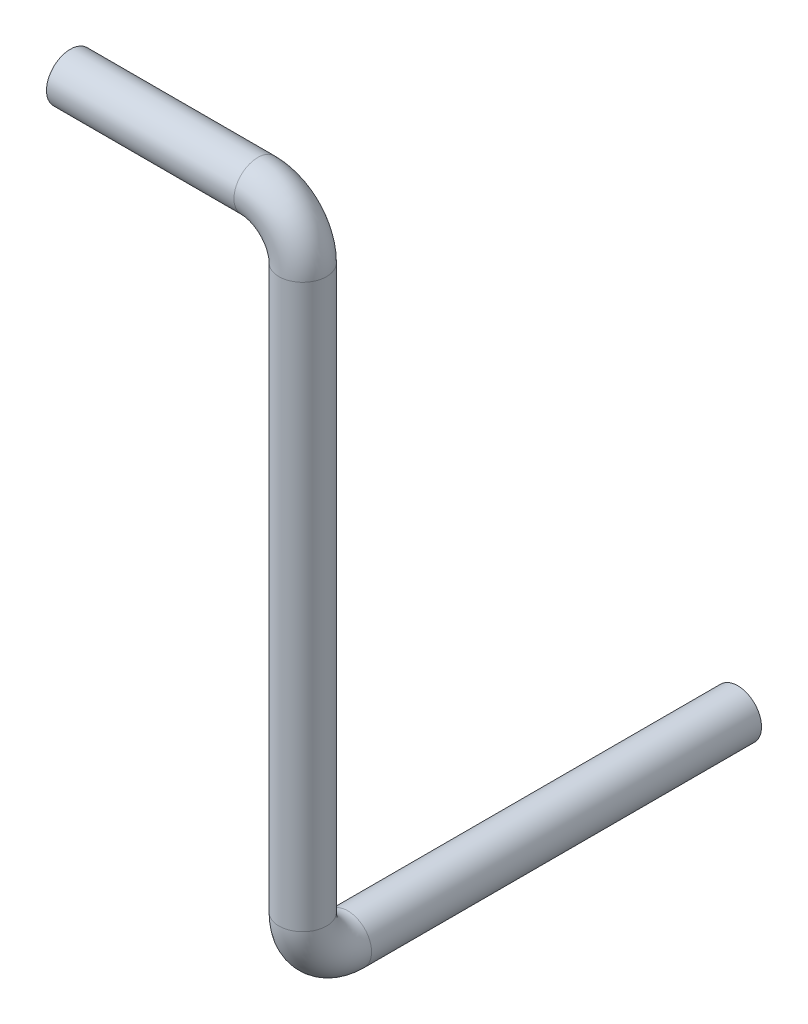
ISO-10303-21;
HEADER;
FILE_DESCRIPTION(('STEP AP214'),'2;1');
FILE_NAME('part.step','',(''),(''),'','','');
FILE_SCHEMA(('AUTOMOTIVE_DESIGN { 1 0 10303 214 1 1 1 1 }'));
ENDSEC;
DATA;
#1=APPLICATION_CONTEXT('core data for automotive mechanical design processes');
#2=APPLICATION_PROTOCOL_DEFINITION('international standard','automotive_design',2000,#1);
#3=PRODUCT_CONTEXT('',#1,'mechanical');
#4=PRODUCT('Part','Part','',(#3));
#5=PRODUCT_RELATED_PRODUCT_CATEGORY('part','',(#4));
#6=PRODUCT_DEFINITION_FORMATION('','',#4);
#7=PRODUCT_DEFINITION_CONTEXT('part definition',#1,'design');
#8=PRODUCT_DEFINITION('design','',#6,#7);
#9=PRODUCT_DEFINITION_SHAPE('','',#8);
#10=(LENGTH_UNIT() NAMED_UNIT(*) SI_UNIT(.MILLI.,.METRE.));
#11=(NAMED_UNIT(*) PLANE_ANGLE_UNIT() SI_UNIT($,.RADIAN.));
#12=(NAMED_UNIT(*) SI_UNIT($,.STERADIAN.) SOLID_ANGLE_UNIT());
#13=UNCERTAINTY_MEASURE_WITH_UNIT(LENGTH_MEASURE(1.E-05),#10,'distance_accuracy_value','');
#14=(GEOMETRIC_REPRESENTATION_CONTEXT(3) GLOBAL_UNCERTAINTY_ASSIGNED_CONTEXT((#13)) GLOBAL_UNIT_ASSIGNED_CONTEXT((#10,
#11,#12)) REPRESENTATION_CONTEXT('',''));
#15=CARTESIAN_POINT('',(0.,0.,0.));
#16=DIRECTION('',(0.,0.,1.));
#17=DIRECTION('',(1.,0.,0.));
#18=AXIS2_PLACEMENT_3D('',#15,#16,#17);
#19=CARTESIAN_POINT('',(154.,167.,70.));
#20=DIRECTION('',(-1.,0.,0.));
#21=DIRECTION('',(0.,1.,0.));
#22=AXIS2_PLACEMENT_3D('',#19,#20,#21);
#23=PLANE('',#22);
#24=CARTESIAN_POINT('',(154.,167.,70.));
#25=DIRECTION('',(-1.,0.,0.));
#26=DIRECTION('',(0.,1.,0.));
#27=AXIS2_PLACEMENT_3D('',#24,#25,#26);
#28=CIRCLE('',#27,2.17500000000001);
#29=CARTESIAN_POINT('',(154.,169.175,70.));
#30=VERTEX_POINT('',#29);
#31=EDGE_CURVE('E213',#30,#30,#28,.T.);
#32=ORIENTED_EDGE('',*,*,#31,.F.);
#33=EDGE_LOOP('',(#32));
#34=FACE_BOUND('',#33,.T.);
#35=CARTESIAN_POINT('',(154.,167.,70.));
#36=DIRECTION('',(-1.,0.,0.));
#37=DIRECTION('',(0.,0.,1.));
#38=AXIS2_PLACEMENT_3D('',#35,#36,#37);
#39=CIRCLE('',#38,3.17500000000001);
#40=CARTESIAN_POINT('',(154.,167.,73.175));
#41=VERTEX_POINT('',#40);
#42=EDGE_CURVE('E75',#41,#41,#39,.T.);
#43=ORIENTED_EDGE('',*,*,#42,.T.);
#44=EDGE_LOOP('',(#43));
#45=FACE_BOUND('',#44,.T.);
#46=ADVANCED_FACE('F52',(#34,#45),#23,.T.);
#47=CARTESIAN_POINT('',(185.,80.,12.));
#48=DIRECTION('',(0.,0.,1.));
#49=DIRECTION('',(1.,0.,0.));
#50=AXIS2_PLACEMENT_3D('',#47,#48,#49);
#51=PLANE('',#50);
#52=CARTESIAN_POINT('',(185.,80.,12.));
#53=DIRECTION('',(0.,0.,1.));
#54=DIRECTION('',(1.,0.,0.));
#55=AXIS2_PLACEMENT_3D('',#52,#53,#54);
#56=CIRCLE('',#55,2.17500000000001);
#57=CARTESIAN_POINT('',(187.175,80.,12.));
#58=VERTEX_POINT('',#57);
#59=EDGE_CURVE('E73',#58,#58,#56,.T.);
#60=ORIENTED_EDGE('',*,*,#59,.T.);
#61=EDGE_LOOP('',(#60));
#62=FACE_BOUND('',#61,.T.);
#63=CARTESIAN_POINT('',(185.,80.,12.));
#64=DIRECTION('',(0.,0.,1.));
#65=DIRECTION('',(1.,0.,0.));
#66=AXIS2_PLACEMENT_3D('',#63,#64,#65);
#67=CIRCLE('',#66,3.17500000000001);
#68=CARTESIAN_POINT('',(188.175,80.,12.));
#69=VERTEX_POINT('',#68);
#70=EDGE_CURVE('E11',#69,#69,#67,.T.);
#71=ORIENTED_EDGE('',*,*,#70,.F.);
#72=EDGE_LOOP('',(#71));
#73=FACE_BOUND('',#72,.T.);
#74=ADVANCED_FACE('F132',(#62,#73),#51,.F.);
#75=CARTESIAN_POINT('',(154.,167.,70.));
#76=DIRECTION('',(1.,0.,0.));
#77=DIRECTION('',(0.,0.,-1.));
#78=AXIS2_PLACEMENT_3D('',#75,#76,#77);
#79=CYLINDRICAL_SURFACE('',#78,3.17500000000001);
#80=CARTESIAN_POINT('',(179.,167.,70.));
#81=DIRECTION('',(1.,0.,0.));
#82=DIRECTION('',(0.,0.,-1.));
#83=AXIS2_PLACEMENT_3D('',#80,#81,#82);
#84=CIRCLE('',#83,3.17500000000001);
#85=CARTESIAN_POINT('',(179.,170.175,70.));
#86=VERTEX_POINT('',#85);
#87=EDGE_CURVE('E74',#86,#86,#84,.F.);
#88=ORIENTED_EDGE('',*,*,#87,.T.);
#89=EDGE_LOOP('',(#88));
#90=FACE_BOUND('',#89,.T.);
#91=ORIENTED_EDGE('',*,*,#42,.F.);
#92=EDGE_LOOP('',(#91));
#93=FACE_BOUND('',#92,.T.);
#94=ADVANCED_FACE('F102',(#90,#93),#79,.T.);
#95=CARTESIAN_POINT('',(179.,161.,70.));
#96=DIRECTION('',(0.,0.,-1.));
#97=DIRECTION('',(-1.,0.,0.));
#98=AXIS2_PLACEMENT_3D('',#95,#96,#97);
#99=TOROIDAL_SURFACE('',#98,6.00000000000001,3.17500000000001);
#100=CARTESIAN_POINT('',(185.,161.,70.));
#101=DIRECTION('',(0.,1.,0.));
#102=DIRECTION('',(-1.,0.,0.));
#103=AXIS2_PLACEMENT_3D('',#100,#101,#102);
#104=CIRCLE('',#103,3.17500000000001);
#105=CARTESIAN_POINT('',(188.175,161.,70.));
#106=VERTEX_POINT('',#105);
#107=EDGE_CURVE('E68',#106,#106,#104,.T.);
#108=CARTESIAN_POINT('',(179.,161.,70.));
#109=DIRECTION('',(0.,0.,-1.));
#110=DIRECTION('',(-1.,0.,0.));
#111=AXIS2_PLACEMENT_3D('',#108,#109,#110);
#112=CIRCLE('',#111,9.17500000000002);
#113=EDGE_CURVE('',#86,#106,#112,.T.);
#114=ORIENTED_EDGE('',*,*,#87,.F.);
#115=ORIENTED_EDGE('',*,*,#107,.T.);
#116=ORIENTED_EDGE('',*,*,#113,.T.);
#117=ORIENTED_EDGE('',*,*,#113,.F.);
#118=EDGE_LOOP('',(#114,#116,#115,#117));
#119=FACE_BOUND('',#118,.T.);
#120=ADVANCED_FACE('F95',(#119),#99,.T.);
#121=CARTESIAN_POINT('',(185.,161.,70.));
#122=DIRECTION('',(0.,-1.,0.));
#123=DIRECTION('',(0.,0.,-1.));
#124=AXIS2_PLACEMENT_3D('',#121,#122,#123);
#125=CYLINDRICAL_SURFACE('',#124,3.17500000000001);
#126=CARTESIAN_POINT('',(185.,86.,70.));
#127=DIRECTION('',(0.,-1.,0.));
#128=DIRECTION('',(0.,0.,-1.));
#129=AXIS2_PLACEMENT_3D('',#126,#127,#128);
#130=CIRCLE('',#129,3.17500000000001);
#131=CARTESIAN_POINT('',(185.,86.,73.175));
#132=VERTEX_POINT('',#131);
#133=EDGE_CURVE('E63',#132,#132,#130,.F.);
#134=ORIENTED_EDGE('',*,*,#133,.T.);
#135=EDGE_LOOP('',(#134));
#136=FACE_BOUND('',#135,.T.);
#137=ORIENTED_EDGE('',*,*,#107,.F.);
#138=EDGE_LOOP('',(#137));
#139=FACE_BOUND('',#138,.T.);
#140=ADVANCED_FACE('F92',(#136,#139),#125,.T.);
#141=CARTESIAN_POINT('',(185.,86.,64.));
#142=DIRECTION('',(1.,0.,0.));
#143=DIRECTION('',(0.,0.,-1.));
#144=AXIS2_PLACEMENT_3D('',#141,#142,#143);
#145=TOROIDAL_SURFACE('',#144,5.99999999999999,3.17500000000001);
#146=CARTESIAN_POINT('',(185.,80.,64.));
#147=DIRECTION('',(0.,0.,1.));
#148=DIRECTION('',(0.,-1.,0.));
#149=AXIS2_PLACEMENT_3D('',#146,#147,#148);
#150=CIRCLE('',#149,3.17500000000001);
#151=CARTESIAN_POINT('',(185.,76.825,64.));
#152=VERTEX_POINT('',#151);
#153=EDGE_CURVE('E58',#152,#152,#150,.T.);
#154=CARTESIAN_POINT('',(185.,86.,64.));
#155=DIRECTION('',(1.,0.,0.));
#156=DIRECTION('',(0.,0.,-1.));
#157=AXIS2_PLACEMENT_3D('',#154,#155,#156);
#158=CIRCLE('',#157,9.175);
#159=EDGE_CURVE('',#132,#152,#158,.T.);
#160=ORIENTED_EDGE('',*,*,#133,.F.);
#161=ORIENTED_EDGE('',*,*,#153,.T.);
#162=ORIENTED_EDGE('',*,*,#159,.T.);
#163=ORIENTED_EDGE('',*,*,#159,.F.);
#164=EDGE_LOOP('',(#160,#162,#161,#163));
#165=FACE_BOUND('',#164,.T.);
#166=ADVANCED_FACE('F100',(#165),#145,.T.);
#167=CARTESIAN_POINT('',(185.,80.,64.));
#168=DIRECTION('',(0.,0.,-1.));
#169=DIRECTION('',(-1.,0.,0.));
#170=AXIS2_PLACEMENT_3D('',#167,#168,#169);
#171=CYLINDRICAL_SURFACE('',#170,3.17500000000001);
#172=ORIENTED_EDGE('',*,*,#70,.T.);
#173=EDGE_LOOP('',(#172));
#174=FACE_BOUND('',#173,.T.);
#175=ORIENTED_EDGE('',*,*,#153,.F.);
#176=EDGE_LOOP('',(#175));
#177=FACE_BOUND('',#176,.T.);
#178=ADVANCED_FACE('F54',(#174,#177),#171,.T.);
#179=CARTESIAN_POINT('',(154.,167.,70.));
#180=DIRECTION('',(1.,0.,0.));
#181=DIRECTION('',(0.,0.,-1.));
#182=AXIS2_PLACEMENT_3D('',#179,#180,#181);
#183=CYLINDRICAL_SURFACE('',#182,2.17500000000001);
#184=CARTESIAN_POINT('',(179.,167.,70.));
#185=DIRECTION('',(-1.,0.,0.));
#186=DIRECTION('',(0.,1.,0.));
#187=AXIS2_PLACEMENT_3D('',#184,#185,#186);
#188=CIRCLE('',#187,2.17500000000001);
#189=CARTESIAN_POINT('',(179.,169.175,70.));
#190=VERTEX_POINT('',#189);
#191=EDGE_CURVE('E212',#190,#190,#188,.T.);
#192=ORIENTED_EDGE('',*,*,#191,.F.);
#193=EDGE_LOOP('',(#192));
#194=FACE_BOUND('',#193,.T.);
#195=ORIENTED_EDGE('',*,*,#31,.T.);
#196=EDGE_LOOP('',(#195));
#197=FACE_BOUND('',#196,.T.);
#198=ADVANCED_FACE('F110',(#194,#197),#183,.F.);
#199=CARTESIAN_POINT('',(179.,161.,70.));
#200=DIRECTION('',(0.,0.,-1.));
#201=DIRECTION('',(-1.,0.,0.));
#202=AXIS2_PLACEMENT_3D('',#199,#200,#201);
#203=TOROIDAL_SURFACE('',#202,6.00000000000001,2.17500000000001);
#204=CARTESIAN_POINT('',(185.,161.,70.));
#205=DIRECTION('',(0.,1.,0.));
#206=DIRECTION('',(1.,0.,0.));
#207=AXIS2_PLACEMENT_3D('',#204,#205,#206);
#208=CIRCLE('',#207,2.17500000000001);
#209=CARTESIAN_POINT('',(187.175,161.,70.));
#210=VERTEX_POINT('',#209);
#211=EDGE_CURVE('E220',#210,#210,#208,.T.);
#212=CARTESIAN_POINT('',(179.,161.,70.));
#213=DIRECTION('',(0.,0.,-1.));
#214=DIRECTION('',(-1.,0.,0.));
#215=AXIS2_PLACEMENT_3D('',#212,#213,#214);
#216=CIRCLE('',#215,8.17500000000001);
#217=EDGE_CURVE('',#190,#210,#216,.T.);
#218=ORIENTED_EDGE('',*,*,#191,.T.);
#219=ORIENTED_EDGE('',*,*,#211,.F.);
#220=ORIENTED_EDGE('',*,*,#217,.T.);
#221=ORIENTED_EDGE('',*,*,#217,.F.);
#222=EDGE_LOOP('',(#218,#220,#219,#221));
#223=FACE_BOUND('',#222,.T.);
#224=ADVANCED_FACE('F112',(#223),#203,.F.);
#225=CARTESIAN_POINT('',(185.,161.,70.));
#226=DIRECTION('',(0.,-1.,0.));
#227=DIRECTION('',(0.,0.,-1.));
#228=AXIS2_PLACEMENT_3D('',#225,#226,#227);
#229=CYLINDRICAL_SURFACE('',#228,2.17500000000001);
#230=CARTESIAN_POINT('',(185.,86.,70.));
#231=DIRECTION('',(0.,1.,0.));
#232=DIRECTION('',(1.,0.,0.));
#233=AXIS2_PLACEMENT_3D('',#230,#231,#232);
#234=CIRCLE('',#233,2.17500000000001);
#235=CARTESIAN_POINT('',(185.,86.,72.175));
#236=VERTEX_POINT('',#235);
#237=EDGE_CURVE('E88',#236,#236,#234,.T.);
#238=ORIENTED_EDGE('',*,*,#237,.F.);
#239=EDGE_LOOP('',(#238));
#240=FACE_BOUND('',#239,.T.);
#241=ORIENTED_EDGE('',*,*,#211,.T.);
#242=EDGE_LOOP('',(#241));
#243=FACE_BOUND('',#242,.T.);
#244=ADVANCED_FACE('F120',(#240,#243),#229,.F.);
#245=CARTESIAN_POINT('',(185.,86.,64.));
#246=DIRECTION('',(1.,0.,0.));
#247=DIRECTION('',(0.,0.,-1.));
#248=AXIS2_PLACEMENT_3D('',#245,#246,#247);
#249=TOROIDAL_SURFACE('',#248,5.99999999999999,2.17500000000001);
#250=CARTESIAN_POINT('',(185.,80.,64.));
#251=DIRECTION('',(0.,0.,1.));
#252=DIRECTION('',(1.,0.,0.));
#253=AXIS2_PLACEMENT_3D('',#250,#251,#252);
#254=CIRCLE('',#253,2.17500000000001);
#255=CARTESIAN_POINT('',(185.,77.825,64.));
#256=VERTEX_POINT('',#255);
#257=EDGE_CURVE('E81',#256,#256,#254,.T.);
#258=CARTESIAN_POINT('',(185.,86.,64.));
#259=DIRECTION('',(1.,0.,0.));
#260=DIRECTION('',(0.,0.,-1.));
#261=AXIS2_PLACEMENT_3D('',#258,#259,#260);
#262=CIRCLE('',#261,8.175);
#263=EDGE_CURVE('',#236,#256,#262,.T.);
#264=ORIENTED_EDGE('',*,*,#237,.T.);
#265=ORIENTED_EDGE('',*,*,#257,.F.);
#266=ORIENTED_EDGE('',*,*,#263,.T.);
#267=ORIENTED_EDGE('',*,*,#263,.F.);
#268=EDGE_LOOP('',(#264,#266,#265,#267));
#269=FACE_BOUND('',#268,.T.);
#270=ADVANCED_FACE('F127',(#269),#249,.F.);
#271=CARTESIAN_POINT('',(185.,80.,64.));
#272=DIRECTION('',(0.,0.,-1.));
#273=DIRECTION('',(-1.,0.,0.));
#274=AXIS2_PLACEMENT_3D('',#271,#272,#273);
#275=CYLINDRICAL_SURFACE('',#274,2.17500000000001);
#276=ORIENTED_EDGE('',*,*,#59,.F.);
#277=EDGE_LOOP('',(#276));
#278=FACE_BOUND('',#277,.T.);
#279=ORIENTED_EDGE('',*,*,#257,.T.);
#280=EDGE_LOOP('',(#279));
#281=FACE_BOUND('',#280,.T.);
#282=ADVANCED_FACE('F128',(#278,#281),#275,.F.);
#283=CLOSED_SHELL('',(#46,#74,#94,#120,#140,#166,#178,#198,#224,#244,#270,#282));
#284=MANIFOLD_SOLID_BREP('B2',#283);
#285=ADVANCED_BREP_SHAPE_REPRESENTATION('',(#18,#284),#14);
#286=SHAPE_DEFINITION_REPRESENTATION(#9,#285);
ENDSEC;
END-ISO-10303-21;
